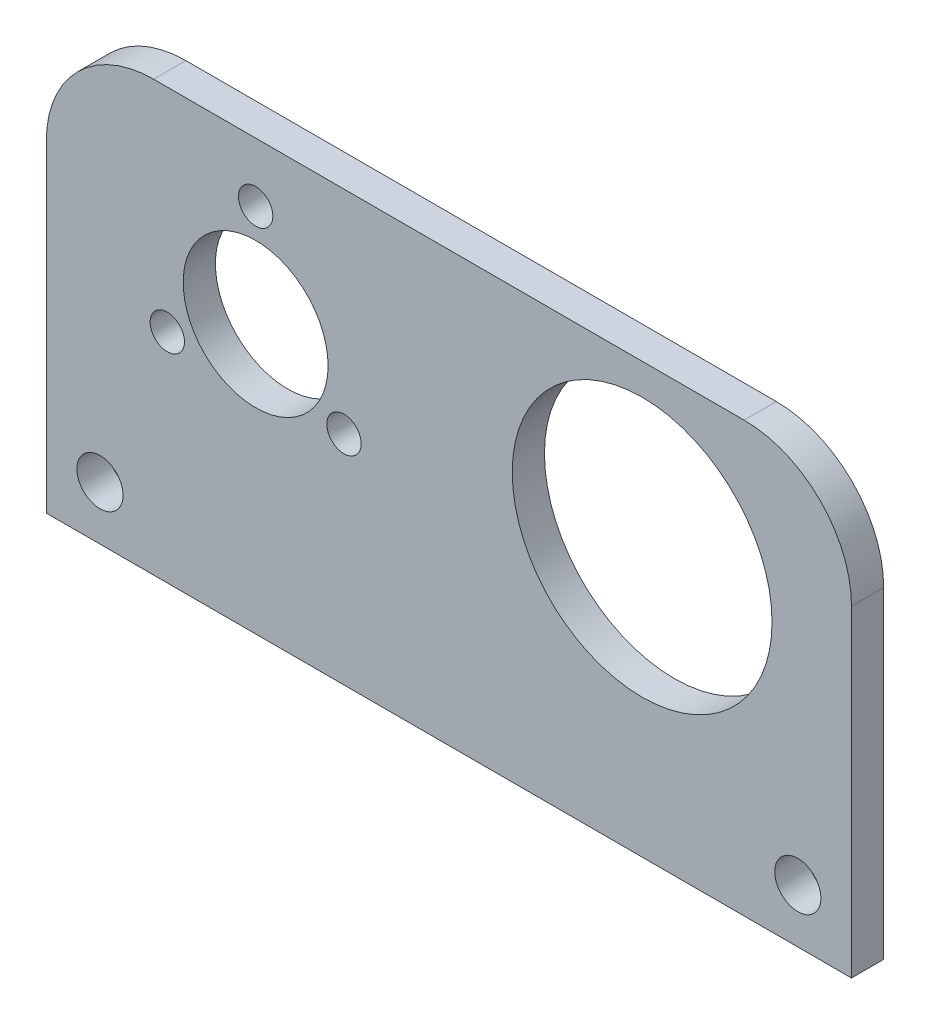
ISO-10303-21;
HEADER;
FILE_DESCRIPTION(('STEP AP214'),'2;1');
FILE_NAME('part.step','',(''),(''),'','','');
FILE_SCHEMA(('AUTOMOTIVE_DESIGN { 1 0 10303 214 1 1 1 1 }'));
ENDSEC;
DATA;
#1=APPLICATION_CONTEXT('core data for automotive mechanical design processes');
#2=APPLICATION_PROTOCOL_DEFINITION('international standard','automotive_design',2000,#1);
#3=PRODUCT_CONTEXT('',#1,'mechanical');
#4=PRODUCT('Part','Part','',(#3));
#5=PRODUCT_RELATED_PRODUCT_CATEGORY('part','',(#4));
#6=PRODUCT_DEFINITION_FORMATION('','',#4);
#7=PRODUCT_DEFINITION_CONTEXT('part definition',#1,'design');
#8=PRODUCT_DEFINITION('design','',#6,#7);
#9=PRODUCT_DEFINITION_SHAPE('','',#8);
#10=(LENGTH_UNIT() NAMED_UNIT(*) SI_UNIT(.MILLI.,.METRE.));
#11=(NAMED_UNIT(*) PLANE_ANGLE_UNIT() SI_UNIT($,.RADIAN.));
#12=(NAMED_UNIT(*) SI_UNIT($,.STERADIAN.) SOLID_ANGLE_UNIT());
#13=UNCERTAINTY_MEASURE_WITH_UNIT(LENGTH_MEASURE(1.E-05),#10,'distance_accuracy_value','');
#14=(GEOMETRIC_REPRESENTATION_CONTEXT(3) GLOBAL_UNCERTAINTY_ASSIGNED_CONTEXT((#13)) GLOBAL_UNIT_ASSIGNED_CONTEXT((#10,
#11,#12)) REPRESENTATION_CONTEXT('',''));
#15=CARTESIAN_POINT('',(0.,0.,0.));
#16=DIRECTION('',(0.,0.,1.));
#17=DIRECTION('',(1.,0.,0.));
#18=AXIS2_PLACEMENT_3D('',#15,#16,#17);
#19=CARTESIAN_POINT('',(0.,0.,3.));
#20=DIRECTION('',(0.,0.,-1.));
#21=DIRECTION('',(-1.,0.,0.));
#22=AXIS2_PLACEMENT_3D('',#19,#20,#21);
#23=PLANE('',#22);
#24=DIRECTION('',(0.,1.,0.));
#25=VECTOR('',#24,1.);
#26=CARTESIAN_POINT('',(75.,0.,3.));
#27=LINE('',#26,#25);
#28=CARTESIAN_POINT('',(75.,0.,3.));
#29=VERTEX_POINT('',#28);
#30=CARTESIAN_POINT('',(75.,30.,3.));
#31=VERTEX_POINT('',#30);
#32=EDGE_CURVE('E104',#29,#31,#27,.T.);
#33=ORIENTED_EDGE('',*,*,#32,.T.);
#34=CARTESIAN_POINT('',(65.,30.,3.));
#35=DIRECTION('',(0.,0.,-1.));
#36=DIRECTION('',(-1.,0.,0.));
#37=AXIS2_PLACEMENT_3D('',#34,#35,#36);
#38=CIRCLE('',#37,10.);
#39=CARTESIAN_POINT('',(65.,40.,3.));
#40=VERTEX_POINT('',#39);
#41=EDGE_CURVE('E43',#31,#40,#38,.F.);
#42=ORIENTED_EDGE('',*,*,#41,.T.);
#43=DIRECTION('',(-1.,0.,0.));
#44=VECTOR('',#43,1.);
#45=CARTESIAN_POINT('',(0.,40.,3.));
#46=LINE('',#45,#44);
#47=CARTESIAN_POINT('',(10.,40.,3.));
#48=VERTEX_POINT('',#47);
#49=EDGE_CURVE('E114',#40,#48,#46,.T.);
#50=ORIENTED_EDGE('',*,*,#49,.T.);
#51=CARTESIAN_POINT('',(10.,30.,3.));
#52=DIRECTION('',(0.,0.,-1.));
#53=DIRECTION('',(-1.,0.,0.));
#54=AXIS2_PLACEMENT_3D('',#51,#52,#53);
#55=CIRCLE('',#54,10.);
#56=CARTESIAN_POINT('',(0.,30.,3.));
#57=VERTEX_POINT('',#56);
#58=EDGE_CURVE('E50',#48,#57,#55,.F.);
#59=ORIENTED_EDGE('',*,*,#58,.T.);
#60=DIRECTION('',(0.,-1.,0.));
#61=VECTOR('',#60,1.);
#62=CARTESIAN_POINT('',(0.,0.,3.));
#63=LINE('',#62,#61);
#64=CARTESIAN_POINT('',(0.,0.,3.));
#65=VERTEX_POINT('',#64);
#66=EDGE_CURVE('E88',#57,#65,#63,.T.);
#67=ORIENTED_EDGE('',*,*,#66,.T.);
#68=DIRECTION('',(1.,0.,0.));
#69=VECTOR('',#68,1.);
#70=CARTESIAN_POINT('',(0.,0.,3.));
#71=LINE('',#70,#69);
#72=EDGE_CURVE('E91',#65,#29,#71,.T.);
#73=ORIENTED_EDGE('',*,*,#72,.T.);
#74=EDGE_LOOP('',(#33,#42,#50,#59,#67,#73));
#75=FACE_BOUND('',#74,.T.);
#76=CARTESIAN_POINT('',(19.5,25.,3.));
#77=DIRECTION('',(0.,0.,1.));
#78=DIRECTION('',(1.,0.,0.));
#79=AXIS2_PLACEMENT_3D('',#76,#77,#78);
#80=CIRCLE('',#79,6.75);
#81=CARTESIAN_POINT('',(26.25,25.,3.));
#82=VERTEX_POINT('',#81);
#83=EDGE_CURVE('E146',#82,#82,#80,.T.);
#84=ORIENTED_EDGE('',*,*,#83,.F.);
#85=EDGE_LOOP('',(#84));
#86=FACE_BOUND('',#85,.T.);
#87=CARTESIAN_POINT('',(19.5,34.5,3.));
#88=DIRECTION('',(0.,0.,1.));
#89=DIRECTION('',(1.,0.,0.));
#90=AXIS2_PLACEMENT_3D('',#87,#88,#89);
#91=CIRCLE('',#90,1.6);
#92=CARTESIAN_POINT('',(21.1,34.5,3.));
#93=VERTEX_POINT('',#92);
#94=EDGE_CURVE('E152',#93,#93,#91,.T.);
#95=ORIENTED_EDGE('',*,*,#94,.F.);
#96=EDGE_LOOP('',(#95));
#97=FACE_BOUND('',#96,.T.);
#98=CARTESIAN_POINT('',(27.7272413359522,20.25,3.));
#99=DIRECTION('',(0.,0.,1.));
#100=DIRECTION('',(1.,0.,0.));
#101=AXIS2_PLACEMENT_3D('',#98,#99,#100);
#102=CIRCLE('',#101,1.6);
#103=CARTESIAN_POINT('',(29.3272413359522,20.25,3.));
#104=VERTEX_POINT('',#103);
#105=EDGE_CURVE('E158',#104,#104,#102,.T.);
#106=ORIENTED_EDGE('',*,*,#105,.F.);
#107=EDGE_LOOP('',(#106));
#108=FACE_BOUND('',#107,.T.);
#109=CARTESIAN_POINT('',(11.2727586640478,20.25,3.));
#110=DIRECTION('',(0.,0.,1.));
#111=DIRECTION('',(1.,0.,0.));
#112=AXIS2_PLACEMENT_3D('',#109,#110,#111);
#113=CIRCLE('',#112,1.6);
#114=CARTESIAN_POINT('',(12.8727586640478,20.25,3.));
#115=VERTEX_POINT('',#114);
#116=EDGE_CURVE('E164',#115,#115,#113,.T.);
#117=ORIENTED_EDGE('',*,*,#116,.F.);
#118=EDGE_LOOP('',(#117));
#119=FACE_BOUND('',#118,.T.);
#120=CARTESIAN_POINT('',(55.5,25.,3.));
#121=DIRECTION('',(0.,0.,1.));
#122=DIRECTION('',(1.,0.,0.));
#123=AXIS2_PLACEMENT_3D('',#120,#121,#122);
#124=CIRCLE('',#123,12.1);
#125=CARTESIAN_POINT('',(67.6,25.,3.));
#126=VERTEX_POINT('',#125);
#127=EDGE_CURVE('E170',#126,#126,#124,.T.);
#128=ORIENTED_EDGE('',*,*,#127,.F.);
#129=EDGE_LOOP('',(#128));
#130=FACE_BOUND('',#129,.T.);
#131=CARTESIAN_POINT('',(5.,5.,3.));
#132=DIRECTION('',(0.,0.,1.));
#133=DIRECTION('',(1.,0.,0.));
#134=AXIS2_PLACEMENT_3D('',#131,#132,#133);
#135=CIRCLE('',#134,2.15);
#136=CARTESIAN_POINT('',(7.15,5.,3.));
#137=VERTEX_POINT('',#136);
#138=EDGE_CURVE('E176',#137,#137,#135,.T.);
#139=ORIENTED_EDGE('',*,*,#138,.F.);
#140=EDGE_LOOP('',(#139));
#141=FACE_BOUND('',#140,.T.);
#142=CARTESIAN_POINT('',(70.,5.00000000000001,3.));
#143=DIRECTION('',(0.,0.,1.));
#144=DIRECTION('',(-1.,0.,0.));
#145=AXIS2_PLACEMENT_3D('',#142,#143,#144);
#146=CIRCLE('',#145,2.15);
#147=CARTESIAN_POINT('',(67.85,5.00000000000001,3.));
#148=VERTEX_POINT('',#147);
#149=EDGE_CURVE('E182',#148,#148,#146,.T.);
#150=ORIENTED_EDGE('',*,*,#149,.F.);
#151=EDGE_LOOP('',(#150));
#152=FACE_BOUND('',#151,.T.);
#153=ADVANCED_FACE('F35',(#75,#86,#97,#108,#119,#130,#141,#152),#23,.F.);
#154=CARTESIAN_POINT('',(0.,0.,0.));
#155=DIRECTION('',(0.,0.,-1.));
#156=DIRECTION('',(-1.,0.,0.));
#157=AXIS2_PLACEMENT_3D('',#154,#155,#156);
#158=PLANE('',#157);
#159=CARTESIAN_POINT('',(5.,5.,0.));
#160=DIRECTION('',(0.,0.,1.));
#161=DIRECTION('',(1.,0.,0.));
#162=AXIS2_PLACEMENT_3D('',#159,#160,#161);
#163=CIRCLE('',#162,2.15);
#164=CARTESIAN_POINT('',(7.15,5.,0.));
#165=VERTEX_POINT('',#164);
#166=EDGE_CURVE('E179',#165,#165,#163,.T.);
#167=ORIENTED_EDGE('',*,*,#166,.T.);
#168=EDGE_LOOP('',(#167));
#169=FACE_BOUND('',#168,.T.);
#170=CARTESIAN_POINT('',(11.2727586640478,20.25,0.));
#171=DIRECTION('',(0.,0.,1.));
#172=DIRECTION('',(1.,0.,0.));
#173=AXIS2_PLACEMENT_3D('',#170,#171,#172);
#174=CIRCLE('',#173,1.6);
#175=CARTESIAN_POINT('',(12.8727586640478,20.25,0.));
#176=VERTEX_POINT('',#175);
#177=EDGE_CURVE('E167',#176,#176,#174,.T.);
#178=ORIENTED_EDGE('',*,*,#177,.T.);
#179=EDGE_LOOP('',(#178));
#180=FACE_BOUND('',#179,.T.);
#181=CARTESIAN_POINT('',(19.5,34.5,0.));
#182=DIRECTION('',(0.,0.,1.));
#183=DIRECTION('',(1.,0.,0.));
#184=AXIS2_PLACEMENT_3D('',#181,#182,#183);
#185=CIRCLE('',#184,1.6);
#186=CARTESIAN_POINT('',(21.1,34.5,0.));
#187=VERTEX_POINT('',#186);
#188=EDGE_CURVE('E155',#187,#187,#185,.T.);
#189=ORIENTED_EDGE('',*,*,#188,.T.);
#190=EDGE_LOOP('',(#189));
#191=FACE_BOUND('',#190,.T.);
#192=DIRECTION('',(-1.,0.,0.));
#193=VECTOR('',#192,1.);
#194=CARTESIAN_POINT('',(0.,40.,0.));
#195=LINE('',#194,#193);
#196=CARTESIAN_POINT('',(65.,40.,0.));
#197=VERTEX_POINT('',#196);
#198=CARTESIAN_POINT('',(10.,40.,0.));
#199=VERTEX_POINT('',#198);
#200=EDGE_CURVE('E96',#197,#199,#195,.T.);
#201=ORIENTED_EDGE('',*,*,#200,.F.);
#202=CARTESIAN_POINT('',(65.,30.,0.));
#203=DIRECTION('',(0.,0.,-1.));
#204=DIRECTION('',(-1.,0.,0.));
#205=AXIS2_PLACEMENT_3D('',#202,#203,#204);
#206=CIRCLE('',#205,10.);
#207=CARTESIAN_POINT('',(75.,30.,0.));
#208=VERTEX_POINT('',#207);
#209=EDGE_CURVE('E122',#197,#208,#206,.T.);
#210=ORIENTED_EDGE('',*,*,#209,.T.);
#211=DIRECTION('',(0.,1.,0.));
#212=VECTOR('',#211,1.);
#213=CARTESIAN_POINT('',(75.,0.,0.));
#214=LINE('',#213,#212);
#215=CARTESIAN_POINT('',(75.,0.,0.));
#216=VERTEX_POINT('',#215);
#217=EDGE_CURVE('E140',#216,#208,#214,.T.);
#218=ORIENTED_EDGE('',*,*,#217,.F.);
#219=DIRECTION('',(1.,0.,0.));
#220=VECTOR('',#219,1.);
#221=CARTESIAN_POINT('',(0.,0.,0.));
#222=LINE('',#221,#220);
#223=CARTESIAN_POINT('',(0.,0.,0.));
#224=VERTEX_POINT('',#223);
#225=EDGE_CURVE('E142',#224,#216,#222,.T.);
#226=ORIENTED_EDGE('',*,*,#225,.F.);
#227=DIRECTION('',(0.,-1.,0.));
#228=VECTOR('',#227,1.);
#229=CARTESIAN_POINT('',(0.,0.,0.));
#230=LINE('',#229,#228);
#231=CARTESIAN_POINT('',(0.,30.,0.));
#232=VERTEX_POINT('',#231);
#233=EDGE_CURVE('E108',#232,#224,#230,.T.);
#234=ORIENTED_EDGE('',*,*,#233,.F.);
#235=CARTESIAN_POINT('',(10.,30.,0.));
#236=DIRECTION('',(0.,0.,-1.));
#237=DIRECTION('',(-1.,0.,0.));
#238=AXIS2_PLACEMENT_3D('',#235,#236,#237);
#239=CIRCLE('',#238,10.);
#240=EDGE_CURVE('E120',#232,#199,#239,.T.);
#241=ORIENTED_EDGE('',*,*,#240,.T.);
#242=EDGE_LOOP('',(#201,#210,#218,#226,#234,#241));
#243=FACE_BOUND('',#242,.T.);
#244=CARTESIAN_POINT('',(19.5,25.,0.));
#245=DIRECTION('',(0.,0.,1.));
#246=DIRECTION('',(1.,0.,0.));
#247=AXIS2_PLACEMENT_3D('',#244,#245,#246);
#248=CIRCLE('',#247,6.75);
#249=CARTESIAN_POINT('',(26.25,25.,0.));
#250=VERTEX_POINT('',#249);
#251=EDGE_CURVE('E149',#250,#250,#248,.T.);
#252=ORIENTED_EDGE('',*,*,#251,.T.);
#253=EDGE_LOOP('',(#252));
#254=FACE_BOUND('',#253,.T.);
#255=CARTESIAN_POINT('',(27.7272413359522,20.25,0.));
#256=DIRECTION('',(0.,0.,1.));
#257=DIRECTION('',(1.,0.,0.));
#258=AXIS2_PLACEMENT_3D('',#255,#256,#257);
#259=CIRCLE('',#258,1.6);
#260=CARTESIAN_POINT('',(29.3272413359522,20.25,0.));
#261=VERTEX_POINT('',#260);
#262=EDGE_CURVE('E161',#261,#261,#259,.T.);
#263=ORIENTED_EDGE('',*,*,#262,.T.);
#264=EDGE_LOOP('',(#263));
#265=FACE_BOUND('',#264,.T.);
#266=CARTESIAN_POINT('',(55.5,25.,0.));
#267=DIRECTION('',(0.,0.,1.));
#268=DIRECTION('',(1.,0.,0.));
#269=AXIS2_PLACEMENT_3D('',#266,#267,#268);
#270=CIRCLE('',#269,12.1);
#271=CARTESIAN_POINT('',(67.6,25.,0.));
#272=VERTEX_POINT('',#271);
#273=EDGE_CURVE('E173',#272,#272,#270,.T.);
#274=ORIENTED_EDGE('',*,*,#273,.T.);
#275=EDGE_LOOP('',(#274));
#276=FACE_BOUND('',#275,.T.);
#277=CARTESIAN_POINT('',(70.,5.00000000000001,0.));
#278=DIRECTION('',(0.,0.,1.));
#279=DIRECTION('',(-1.,0.,0.));
#280=AXIS2_PLACEMENT_3D('',#277,#278,#279);
#281=CIRCLE('',#280,2.15);
#282=CARTESIAN_POINT('',(67.85,5.00000000000001,0.));
#283=VERTEX_POINT('',#282);
#284=EDGE_CURVE('E185',#283,#283,#281,.T.);
#285=ORIENTED_EDGE('',*,*,#284,.T.);
#286=EDGE_LOOP('',(#285));
#287=FACE_BOUND('',#286,.T.);
#288=ADVANCED_FACE('F138',(#169,#180,#191,#243,#254,#265,#276,#287),#158,.T.);
#289=CARTESIAN_POINT('',(0.,0.,3.));
#290=DIRECTION('',(1.,0.,0.));
#291=DIRECTION('',(0.,0.,-1.));
#292=AXIS2_PLACEMENT_3D('',#289,#290,#291);
#293=PLANE('',#292);
#294=ORIENTED_EDGE('',*,*,#66,.F.);
#295=DIRECTION('',(0.,0.,-1.));
#296=VECTOR('',#295,1.);
#297=CARTESIAN_POINT('',(0.,30.,3.));
#298=LINE('',#297,#296);
#299=EDGE_CURVE('E11',#57,#232,#298,.T.);
#300=ORIENTED_EDGE('',*,*,#299,.T.);
#301=ORIENTED_EDGE('',*,*,#233,.T.);
#302=DIRECTION('',(0.,0.,-1.));
#303=VECTOR('',#302,1.);
#304=CARTESIAN_POINT('',(0.,0.,3.));
#305=LINE('',#304,#303);
#306=EDGE_CURVE('E101',#65,#224,#305,.T.);
#307=ORIENTED_EDGE('',*,*,#306,.F.);
#308=EDGE_LOOP('',(#294,#300,#301,#307));
#309=FACE_BOUND('',#308,.T.);
#310=ADVANCED_FACE('F106',(#309),#293,.F.);
#311=CARTESIAN_POINT('',(0.,0.,3.));
#312=DIRECTION('',(0.,1.,0.));
#313=DIRECTION('',(-1.,0.,0.));
#314=AXIS2_PLACEMENT_3D('',#311,#312,#313);
#315=PLANE('',#314);
#316=ORIENTED_EDGE('',*,*,#225,.T.);
#317=DIRECTION('',(0.,0.,-1.));
#318=VECTOR('',#317,1.);
#319=CARTESIAN_POINT('',(75.,0.,3.));
#320=LINE('',#319,#318);
#321=EDGE_CURVE('E103',#29,#216,#320,.T.);
#322=ORIENTED_EDGE('',*,*,#321,.F.);
#323=ORIENTED_EDGE('',*,*,#72,.F.);
#324=ORIENTED_EDGE('',*,*,#306,.T.);
#325=EDGE_LOOP('',(#316,#322,#323,#324));
#326=FACE_BOUND('',#325,.T.);
#327=ADVANCED_FACE('F100',(#326),#315,.F.);
#328=CARTESIAN_POINT('',(75.,0.,3.));
#329=DIRECTION('',(-1.,0.,0.));
#330=DIRECTION('',(0.,-1.,0.));
#331=AXIS2_PLACEMENT_3D('',#328,#329,#330);
#332=PLANE('',#331);
#333=ORIENTED_EDGE('',*,*,#217,.T.);
#334=DIRECTION('',(0.,0.,-1.));
#335=VECTOR('',#334,1.);
#336=CARTESIAN_POINT('',(75.,30.,3.));
#337=LINE('',#336,#335);
#338=EDGE_CURVE('E58',#208,#31,#337,.F.);
#339=ORIENTED_EDGE('',*,*,#338,.T.);
#340=ORIENTED_EDGE('',*,*,#32,.F.);
#341=ORIENTED_EDGE('',*,*,#321,.T.);
#342=EDGE_LOOP('',(#333,#339,#340,#341));
#343=FACE_BOUND('',#342,.T.);
#344=ADVANCED_FACE('F141',(#343),#332,.F.);
#345=CARTESIAN_POINT('',(0.,40.,3.));
#346=DIRECTION('',(0.,-1.,0.));
#347=DIRECTION('',(1.,0.,0.));
#348=AXIS2_PLACEMENT_3D('',#345,#346,#347);
#349=PLANE('',#348);
#350=ORIENTED_EDGE('',*,*,#49,.F.);
#351=DIRECTION('',(0.,0.,-1.));
#352=VECTOR('',#351,1.);
#353=CARTESIAN_POINT('',(65.,40.,3.));
#354=LINE('',#353,#352);
#355=EDGE_CURVE('E112',#40,#197,#354,.T.);
#356=ORIENTED_EDGE('',*,*,#355,.T.);
#357=ORIENTED_EDGE('',*,*,#200,.T.);
#358=DIRECTION('',(0.,0.,-1.));
#359=VECTOR('',#358,1.);
#360=CARTESIAN_POINT('',(10.,40.,3.));
#361=LINE('',#360,#359);
#362=EDGE_CURVE('E110',#199,#48,#361,.F.);
#363=ORIENTED_EDGE('',*,*,#362,.T.);
#364=EDGE_LOOP('',(#350,#356,#357,#363));
#365=FACE_BOUND('',#364,.T.);
#366=ADVANCED_FACE('F130',(#365),#349,.F.);
#367=CARTESIAN_POINT('',(19.5,25.,3.));
#368=DIRECTION('',(0.,0.,-1.));
#369=DIRECTION('',(-1.,0.,0.));
#370=AXIS2_PLACEMENT_3D('',#367,#368,#369);
#371=CYLINDRICAL_SURFACE('',#370,6.75);
#372=ORIENTED_EDGE('',*,*,#83,.T.);
#373=EDGE_LOOP('',(#372));
#374=FACE_BOUND('',#373,.T.);
#375=ORIENTED_EDGE('',*,*,#251,.F.);
#376=EDGE_LOOP('',(#375));
#377=FACE_BOUND('',#376,.T.);
#378=ADVANCED_FACE('F202',(#374,#377),#371,.F.);
#379=CARTESIAN_POINT('',(19.5,34.5,3.));
#380=DIRECTION('',(0.,0.,-1.));
#381=DIRECTION('',(-1.,0.,0.));
#382=AXIS2_PLACEMENT_3D('',#379,#380,#381);
#383=CYLINDRICAL_SURFACE('',#382,1.6);
#384=ORIENTED_EDGE('',*,*,#94,.T.);
#385=EDGE_LOOP('',(#384));
#386=FACE_BOUND('',#385,.T.);
#387=ORIENTED_EDGE('',*,*,#188,.F.);
#388=EDGE_LOOP('',(#387));
#389=FACE_BOUND('',#388,.T.);
#390=ADVANCED_FACE('F236',(#386,#389),#383,.F.);
#391=CARTESIAN_POINT('',(27.7272413359522,20.25,3.));
#392=DIRECTION('',(0.,0.,-1.));
#393=DIRECTION('',(-1.,0.,0.));
#394=AXIS2_PLACEMENT_3D('',#391,#392,#393);
#395=CYLINDRICAL_SURFACE('',#394,1.6);
#396=ORIENTED_EDGE('',*,*,#105,.T.);
#397=EDGE_LOOP('',(#396));
#398=FACE_BOUND('',#397,.T.);
#399=ORIENTED_EDGE('',*,*,#262,.F.);
#400=EDGE_LOOP('',(#399));
#401=FACE_BOUND('',#400,.T.);
#402=ADVANCED_FACE('F233',(#398,#401),#395,.F.);
#403=CARTESIAN_POINT('',(11.2727586640478,20.25,3.));
#404=DIRECTION('',(0.,0.,-1.));
#405=DIRECTION('',(-1.,0.,0.));
#406=AXIS2_PLACEMENT_3D('',#403,#404,#405);
#407=CYLINDRICAL_SURFACE('',#406,1.6);
#408=ORIENTED_EDGE('',*,*,#116,.T.);
#409=EDGE_LOOP('',(#408));
#410=FACE_BOUND('',#409,.T.);
#411=ORIENTED_EDGE('',*,*,#177,.F.);
#412=EDGE_LOOP('',(#411));
#413=FACE_BOUND('',#412,.T.);
#414=ADVANCED_FACE('F229',(#410,#413),#407,.F.);
#415=CARTESIAN_POINT('',(55.5,25.,3.));
#416=DIRECTION('',(0.,0.,-1.));
#417=DIRECTION('',(-1.,0.,0.));
#418=AXIS2_PLACEMENT_3D('',#415,#416,#417);
#419=CYLINDRICAL_SURFACE('',#418,12.1);
#420=ORIENTED_EDGE('',*,*,#127,.T.);
#421=EDGE_LOOP('',(#420));
#422=FACE_BOUND('',#421,.T.);
#423=ORIENTED_EDGE('',*,*,#273,.F.);
#424=EDGE_LOOP('',(#423));
#425=FACE_BOUND('',#424,.T.);
#426=ADVANCED_FACE('F223',(#422,#425),#419,.F.);
#427=CARTESIAN_POINT('',(5.,5.,3.));
#428=DIRECTION('',(0.,0.,-1.));
#429=DIRECTION('',(-1.,0.,0.));
#430=AXIS2_PLACEMENT_3D('',#427,#428,#429);
#431=CYLINDRICAL_SURFACE('',#430,2.15);
#432=ORIENTED_EDGE('',*,*,#138,.T.);
#433=EDGE_LOOP('',(#432));
#434=FACE_BOUND('',#433,.T.);
#435=ORIENTED_EDGE('',*,*,#166,.F.);
#436=EDGE_LOOP('',(#435));
#437=FACE_BOUND('',#436,.T.);
#438=ADVANCED_FACE('F218',(#434,#437),#431,.F.);
#439=CARTESIAN_POINT('',(70.,5.00000000000001,3.));
#440=DIRECTION('',(0.,0.,-1.));
#441=DIRECTION('',(-1.,0.,0.));
#442=AXIS2_PLACEMENT_3D('',#439,#440,#441);
#443=CYLINDRICAL_SURFACE('',#442,2.15);
#444=ORIENTED_EDGE('',*,*,#149,.T.);
#445=EDGE_LOOP('',(#444));
#446=FACE_BOUND('',#445,.T.);
#447=ORIENTED_EDGE('',*,*,#284,.F.);
#448=EDGE_LOOP('',(#447));
#449=FACE_BOUND('',#448,.T.);
#450=ADVANCED_FACE('F191',(#446,#449),#443,.F.);
#451=CARTESIAN_POINT('',(65.,30.,3.));
#452=DIRECTION('',(0.,0.,-1.));
#453=DIRECTION('',(-1.,0.,0.));
#454=AXIS2_PLACEMENT_3D('',#451,#452,#453);
#455=CYLINDRICAL_SURFACE('',#454,10.);
#456=ORIENTED_EDGE('',*,*,#41,.F.);
#457=ORIENTED_EDGE('',*,*,#338,.F.);
#458=ORIENTED_EDGE('',*,*,#209,.F.);
#459=ORIENTED_EDGE('',*,*,#355,.F.);
#460=EDGE_LOOP('',(#456,#457,#458,#459));
#461=FACE_BOUND('',#460,.T.);
#462=ADVANCED_FACE('F135',(#461),#455,.T.);
#463=CARTESIAN_POINT('',(10.,30.,3.));
#464=DIRECTION('',(0.,0.,-1.));
#465=DIRECTION('',(-1.,0.,0.));
#466=AXIS2_PLACEMENT_3D('',#463,#464,#465);
#467=CYLINDRICAL_SURFACE('',#466,10.);
#468=ORIENTED_EDGE('',*,*,#58,.F.);
#469=ORIENTED_EDGE('',*,*,#362,.F.);
#470=ORIENTED_EDGE('',*,*,#240,.F.);
#471=ORIENTED_EDGE('',*,*,#299,.F.);
#472=EDGE_LOOP('',(#468,#469,#470,#471));
#473=FACE_BOUND('',#472,.T.);
#474=ADVANCED_FACE('F37',(#473),#467,.T.);
#475=CLOSED_SHELL('',(#153,#288,#310,#327,#344,#366,#378,#390,#402,#414,#426,#438,#450,#462,#474));
#476=MANIFOLD_SOLID_BREP('B2',#475);
#477=ADVANCED_BREP_SHAPE_REPRESENTATION('',(#18,#476),#14);
#478=SHAPE_DEFINITION_REPRESENTATION(#9,#477);
ENDSEC;
END-ISO-10303-21;
